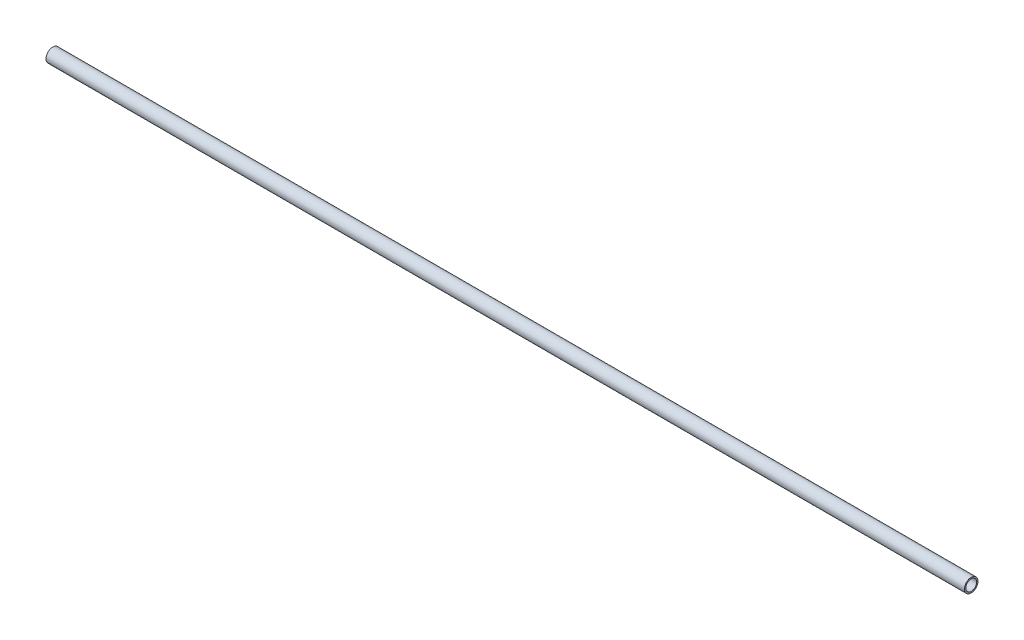
ISO-10303-21;
HEADER;
FILE_DESCRIPTION(('STEP AP214'),'2;1');
FILE_NAME('part.step','',(''),(''),'','','');
FILE_SCHEMA(('AUTOMOTIVE_DESIGN { 1 0 10303 214 1 1 1 1 }'));
ENDSEC;
DATA;
#1=APPLICATION_CONTEXT('core data for automotive mechanical design processes');
#2=APPLICATION_PROTOCOL_DEFINITION('international standard','automotive_design',2000,#1);
#3=PRODUCT_CONTEXT('',#1,'mechanical');
#4=PRODUCT('Part','Part','',(#3));
#5=PRODUCT_RELATED_PRODUCT_CATEGORY('part','',(#4));
#6=PRODUCT_DEFINITION_FORMATION('','',#4);
#7=PRODUCT_DEFINITION_CONTEXT('part definition',#1,'design');
#8=PRODUCT_DEFINITION('design','',#6,#7);
#9=PRODUCT_DEFINITION_SHAPE('','',#8);
#10=(LENGTH_UNIT() NAMED_UNIT(*) SI_UNIT(.MILLI.,.METRE.));
#11=(NAMED_UNIT(*) PLANE_ANGLE_UNIT() SI_UNIT($,.RADIAN.));
#12=(NAMED_UNIT(*) SI_UNIT($,.STERADIAN.) SOLID_ANGLE_UNIT());
#13=UNCERTAINTY_MEASURE_WITH_UNIT(LENGTH_MEASURE(1.E-05),#10,'distance_accuracy_value','');
#14=(GEOMETRIC_REPRESENTATION_CONTEXT(3) GLOBAL_UNCERTAINTY_ASSIGNED_CONTEXT((#13)) GLOBAL_UNIT_ASSIGNED_CONTEXT((#10,
#11,#12)) REPRESENTATION_CONTEXT('',''));
#15=CARTESIAN_POINT('',(0.,0.,0.));
#16=DIRECTION('',(0.,0.,1.));
#17=DIRECTION('',(1.,0.,0.));
#18=AXIS2_PLACEMENT_3D('',#15,#16,#17);
#19=CARTESIAN_POINT('',(337.5,0.,0.));
#20=DIRECTION('',(1.,0.,0.));
#21=DIRECTION('',(0.,0.,-1.));
#22=AXIS2_PLACEMENT_3D('',#19,#20,#21);
#23=PLANE('',#22);
#24=CARTESIAN_POINT('',(337.5,0.,0.));
#25=DIRECTION('',(1.,0.,0.));
#26=DIRECTION('',(0.,0.,-1.));
#27=AXIS2_PLACEMENT_3D('',#24,#25,#26);
#28=CIRCLE('',#27,5.);
#29=CARTESIAN_POINT('',(337.5,0.,-5.));
#30=VERTEX_POINT('',#29);
#31=EDGE_CURVE('E10',#30,#30,#28,.T.);
#32=ORIENTED_EDGE('',*,*,#31,.T.);
#33=EDGE_LOOP('',(#32));
#34=FACE_BOUND('',#33,.T.);
#35=CARTESIAN_POINT('',(337.5,0.,0.));
#36=DIRECTION('',(1.,0.,0.));
#37=DIRECTION('',(0.,0.,-1.));
#38=AXIS2_PLACEMENT_3D('',#35,#36,#37);
#39=CIRCLE('',#38,4.);
#40=CARTESIAN_POINT('',(337.5,0.,-4.));
#41=VERTEX_POINT('',#40);
#42=EDGE_CURVE('E48',#41,#41,#39,.T.);
#43=ORIENTED_EDGE('',*,*,#42,.F.);
#44=EDGE_LOOP('',(#43));
#45=FACE_BOUND('',#44,.T.);
#46=ADVANCED_FACE('F40',(#34,#45),#23,.T.);
#47=CARTESIAN_POINT('',(-337.5,0.,0.));
#48=DIRECTION('',(1.,0.,0.));
#49=DIRECTION('',(0.,0.,-1.));
#50=AXIS2_PLACEMENT_3D('',#47,#48,#49);
#51=PLANE('',#50);
#52=CARTESIAN_POINT('',(-337.5,0.,0.));
#53=DIRECTION('',(1.,0.,0.));
#54=DIRECTION('',(0.,0.,-1.));
#55=AXIS2_PLACEMENT_3D('',#52,#53,#54);
#56=CIRCLE('',#55,5.);
#57=CARTESIAN_POINT('',(-337.5,0.,-5.));
#58=VERTEX_POINT('',#57);
#59=EDGE_CURVE('E41',#58,#58,#56,.T.);
#60=ORIENTED_EDGE('',*,*,#59,.F.);
#61=EDGE_LOOP('',(#60));
#62=FACE_BOUND('',#61,.T.);
#63=CARTESIAN_POINT('',(-337.5,0.,0.));
#64=DIRECTION('',(1.,0.,0.));
#65=DIRECTION('',(0.,0.,-1.));
#66=AXIS2_PLACEMENT_3D('',#63,#64,#65);
#67=CIRCLE('',#66,4.);
#68=CARTESIAN_POINT('',(-337.5,0.,-4.));
#69=VERTEX_POINT('',#68);
#70=EDGE_CURVE('E49',#69,#69,#67,.T.);
#71=ORIENTED_EDGE('',*,*,#70,.T.);
#72=EDGE_LOOP('',(#71));
#73=FACE_BOUND('',#72,.T.);
#74=ADVANCED_FACE('F58',(#62,#73),#51,.F.);
#75=CARTESIAN_POINT('',(337.5,0.,0.));
#76=DIRECTION('',(-1.,0.,0.));
#77=DIRECTION('',(0.,0.,1.));
#78=AXIS2_PLACEMENT_3D('',#75,#76,#77);
#79=CYLINDRICAL_SURFACE('',#78,5.);
#80=ORIENTED_EDGE('',*,*,#31,.F.);
#81=EDGE_LOOP('',(#80));
#82=FACE_BOUND('',#81,.T.);
#83=ORIENTED_EDGE('',*,*,#59,.T.);
#84=EDGE_LOOP('',(#83));
#85=FACE_BOUND('',#84,.T.);
#86=ADVANCED_FACE('F39',(#82,#85),#79,.T.);
#87=CARTESIAN_POINT('',(337.5,0.,0.));
#88=DIRECTION('',(-1.,0.,0.));
#89=DIRECTION('',(0.,0.,1.));
#90=AXIS2_PLACEMENT_3D('',#87,#88,#89);
#91=CYLINDRICAL_SURFACE('',#90,4.);
#92=ORIENTED_EDGE('',*,*,#42,.T.);
#93=EDGE_LOOP('',(#92));
#94=FACE_BOUND('',#93,.T.);
#95=ORIENTED_EDGE('',*,*,#70,.F.);
#96=EDGE_LOOP('',(#95));
#97=FACE_BOUND('',#96,.T.);
#98=ADVANCED_FACE('F57',(#94,#97),#91,.F.);
#99=CLOSED_SHELL('',(#46,#74,#86,#98));
#100=MANIFOLD_SOLID_BREP('B2',#99);
#101=ADVANCED_BREP_SHAPE_REPRESENTATION('',(#18,#100),#14);
#102=SHAPE_DEFINITION_REPRESENTATION(#9,#101);
ENDSEC;
END-ISO-10303-21;
